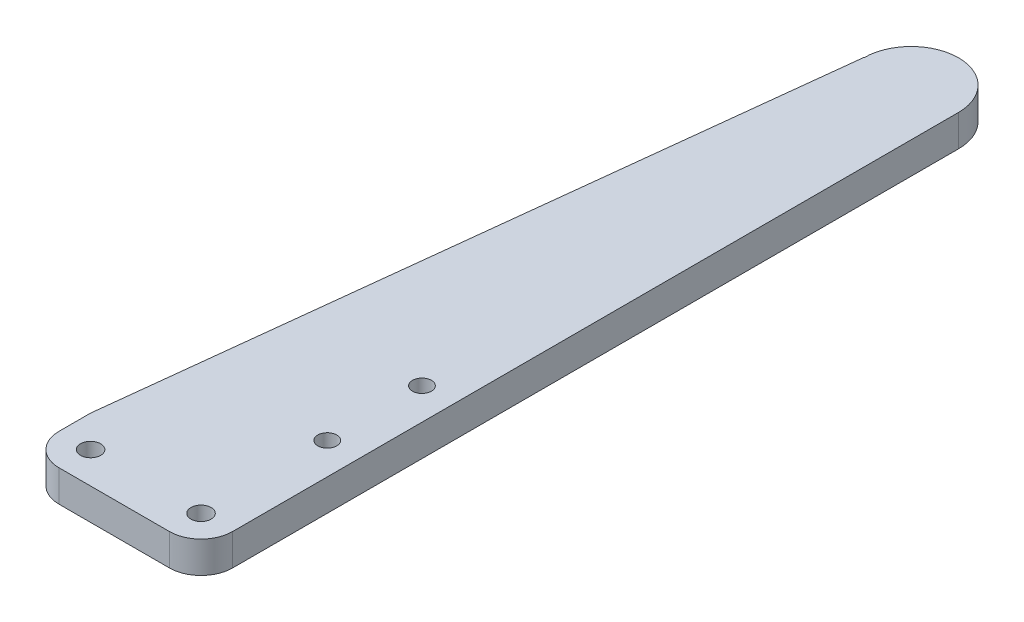
ISO-10303-21;
HEADER;
FILE_DESCRIPTION(('STEP AP214'),'2;1');
FILE_NAME('part.step','',(''),(''),'','','');
FILE_SCHEMA(('AUTOMOTIVE_DESIGN { 1 0 10303 214 1 1 1 1 }'));
ENDSEC;
DATA;
#1=APPLICATION_CONTEXT('core data for automotive mechanical design processes');
#2=APPLICATION_PROTOCOL_DEFINITION('international standard','automotive_design',2000,#1);
#3=PRODUCT_CONTEXT('',#1,'mechanical');
#4=PRODUCT('Part','Part','',(#3));
#5=PRODUCT_RELATED_PRODUCT_CATEGORY('part','',(#4));
#6=PRODUCT_DEFINITION_FORMATION('','',#4);
#7=PRODUCT_DEFINITION_CONTEXT('part definition',#1,'design');
#8=PRODUCT_DEFINITION('design','',#6,#7);
#9=PRODUCT_DEFINITION_SHAPE('','',#8);
#10=(LENGTH_UNIT() NAMED_UNIT(*) SI_UNIT(.MILLI.,.METRE.));
#11=(NAMED_UNIT(*) PLANE_ANGLE_UNIT() SI_UNIT($,.RADIAN.));
#12=(NAMED_UNIT(*) SI_UNIT($,.STERADIAN.) SOLID_ANGLE_UNIT());
#13=UNCERTAINTY_MEASURE_WITH_UNIT(LENGTH_MEASURE(1.E-05),#10,'distance_accuracy_value','');
#14=(GEOMETRIC_REPRESENTATION_CONTEXT(3) GLOBAL_UNCERTAINTY_ASSIGNED_CONTEXT((#13)) GLOBAL_UNIT_ASSIGNED_CONTEXT((#10,
#11,#12)) REPRESENTATION_CONTEXT('',''));
#15=CARTESIAN_POINT('',(0.,0.,0.));
#16=DIRECTION('',(0.,0.,1.));
#17=DIRECTION('',(1.,0.,0.));
#18=AXIS2_PLACEMENT_3D('',#15,#16,#17);
#19=CARTESIAN_POINT('',(6.25000000000002,5.,-60.));
#20=DIRECTION('',(0.,-1.,0.));
#21=DIRECTION('',(0.,0.,-1.));
#22=AXIS2_PLACEMENT_3D('',#19,#20,#21);
#23=CYLINDRICAL_SURFACE('',#22,7.49999999999999);
#24=CARTESIAN_POINT('',(6.25000000000002,0.,-60.));
#25=DIRECTION('',(0.,1.,0.));
#26=DIRECTION('',(0.,0.,1.));
#27=AXIS2_PLACEMENT_3D('',#24,#25,#26);
#28=CIRCLE('',#27,7.49999999999999);
#29=CARTESIAN_POINT('',(13.75,0.,-60.));
#30=VERTEX_POINT('',#29);
#31=CARTESIAN_POINT('',(-1.24999999999996,0.,-60.));
#32=VERTEX_POINT('',#31);
#33=EDGE_CURVE('E125',#30,#32,#28,.T.);
#34=ORIENTED_EDGE('',*,*,#33,.T.);
#35=DIRECTION('',(0.,-1.,0.));
#36=VECTOR('',#35,1.);
#37=CARTESIAN_POINT('',(-1.24999999999996,5.,-60.));
#38=LINE('',#37,#36);
#39=CARTESIAN_POINT('',(-1.24999999999996,5.,-60.));
#40=VERTEX_POINT('',#39);
#41=EDGE_CURVE('E123',#40,#32,#38,.T.);
#42=ORIENTED_EDGE('',*,*,#41,.F.);
#43=CARTESIAN_POINT('',(6.25000000000002,5.,-60.));
#44=DIRECTION('',(0.,1.,0.));
#45=DIRECTION('',(0.,0.,1.));
#46=AXIS2_PLACEMENT_3D('',#43,#44,#45);
#47=CIRCLE('',#46,7.49999999999999);
#48=CARTESIAN_POINT('',(13.75,5.,-60.));
#49=VERTEX_POINT('',#48);
#50=EDGE_CURVE('E108',#49,#40,#47,.T.);
#51=ORIENTED_EDGE('',*,*,#50,.F.);
#52=DIRECTION('',(0.,-1.,0.));
#53=VECTOR('',#52,1.);
#54=CARTESIAN_POINT('',(13.75,5.,-60.));
#55=LINE('',#54,#53);
#56=EDGE_CURVE('E171',#49,#30,#55,.T.);
#57=ORIENTED_EDGE('',*,*,#56,.T.);
#58=EDGE_LOOP('',(#34,#42,#51,#57));
#59=FACE_BOUND('',#58,.T.);
#60=ADVANCED_FACE('F42',(#59),#23,.T.);
#61=CARTESIAN_POINT('',(0.,5.,-60.));
#62=DIRECTION('',(0.,0.,-1.));
#63=DIRECTION('',(-1.,0.,0.));
#64=AXIS2_PLACEMENT_3D('',#61,#62,#63);
#65=PLANE('',#64);
#66=DIRECTION('',(1.,0.,0.));
#67=VECTOR('',#66,1.);
#68=CARTESIAN_POINT('',(0.,0.,-60.));
#69=LINE('',#68,#67);
#70=CARTESIAN_POINT('',(-1.2979011943089,0.,-60.));
#71=VERTEX_POINT('',#70);
#72=EDGE_CURVE('E173',#71,#32,#69,.T.);
#73=ORIENTED_EDGE('',*,*,#72,.F.);
#74=DIRECTION('',(0.,-1.,0.));
#75=VECTOR('',#74,1.);
#76=CARTESIAN_POINT('',(-1.2979011943089,5.,-60.));
#77=LINE('',#76,#75);
#78=CARTESIAN_POINT('',(-1.2979011943089,5.,-60.));
#79=VERTEX_POINT('',#78);
#80=EDGE_CURVE('E130',#79,#71,#77,.T.);
#81=ORIENTED_EDGE('',*,*,#80,.F.);
#82=DIRECTION('',(1.,0.,0.));
#83=VECTOR('',#82,1.);
#84=CARTESIAN_POINT('',(0.,5.,-60.));
#85=LINE('',#84,#83);
#86=EDGE_CURVE('E114',#79,#40,#85,.T.);
#87=ORIENTED_EDGE('',*,*,#86,.T.);
#88=ORIENTED_EDGE('',*,*,#41,.T.);
#89=EDGE_LOOP('',(#73,#81,#87,#88));
#90=FACE_BOUND('',#89,.T.);
#91=ADVANCED_FACE('F132',(#90),#65,.T.);
#92=CARTESIAN_POINT('',(-7.98759846026369,5.,-0.904203320430814));
#93=DIRECTION('',(0.993653706762217,0.,0.112482492138585));
#94=DIRECTION('',(0.112482492138585,0.,-0.993653706762217));
#95=AXIS2_PLACEMENT_3D('',#92,#93,#94);
#96=PLANE('',#95);
#97=DIRECTION('',(-0.112482492138585,0.,0.993653706762217));
#98=VECTOR('',#97,1.);
#99=CARTESIAN_POINT('',(-7.98759846026369,0.,-0.904203320430814));
#100=LINE('',#99,#98);
#101=CARTESIAN_POINT('',(-13.75,0.,50.));
#102=VERTEX_POINT('',#101);
#103=EDGE_CURVE('E175',#71,#102,#100,.T.);
#104=ORIENTED_EDGE('',*,*,#103,.T.);
#105=DIRECTION('',(0.,-1.,0.));
#106=VECTOR('',#105,1.);
#107=CARTESIAN_POINT('',(-13.75,5.,50.));
#108=LINE('',#107,#106);
#109=CARTESIAN_POINT('',(-13.75,5.,50.));
#110=VERTEX_POINT('',#109);
#111=EDGE_CURVE('E197',#110,#102,#108,.T.);
#112=ORIENTED_EDGE('',*,*,#111,.F.);
#113=DIRECTION('',(-0.112482492138585,0.,0.993653706762217));
#114=VECTOR('',#113,1.);
#115=CARTESIAN_POINT('',(-7.98759846026369,5.,-0.904203320430814));
#116=LINE('',#115,#114);
#117=EDGE_CURVE('E135',#79,#110,#116,.T.);
#118=ORIENTED_EDGE('',*,*,#117,.F.);
#119=ORIENTED_EDGE('',*,*,#80,.T.);
#120=EDGE_LOOP('',(#104,#112,#118,#119));
#121=FACE_BOUND('',#120,.T.);
#122=ADVANCED_FACE('F227',(#121),#96,.F.);
#123=CARTESIAN_POINT('',(-13.75,5.,0.));
#124=DIRECTION('',(-1.,0.,0.));
#125=DIRECTION('',(0.,0.,1.));
#126=AXIS2_PLACEMENT_3D('',#123,#124,#125);
#127=PLANE('',#126);
#128=DIRECTION('',(0.,0.,-1.));
#129=VECTOR('',#128,1.);
#130=CARTESIAN_POINT('',(-13.75,0.,0.));
#131=LINE('',#130,#129);
#132=CARTESIAN_POINT('',(-13.75,0.,55.));
#133=VERTEX_POINT('',#132);
#134=EDGE_CURVE('E178',#133,#102,#131,.T.);
#135=ORIENTED_EDGE('',*,*,#134,.F.);
#136=DIRECTION('',(0.,-1.,0.));
#137=VECTOR('',#136,1.);
#138=CARTESIAN_POINT('',(-13.75,5.,55.));
#139=LINE('',#138,#137);
#140=CARTESIAN_POINT('',(-13.75,5.,55.));
#141=VERTEX_POINT('',#140);
#142=EDGE_CURVE('E65',#133,#141,#139,.F.);
#143=ORIENTED_EDGE('',*,*,#142,.T.);
#144=DIRECTION('',(0.,0.,-1.));
#145=VECTOR('',#144,1.);
#146=CARTESIAN_POINT('',(-13.75,5.,0.));
#147=LINE('',#146,#145);
#148=EDGE_CURVE('E138',#141,#110,#147,.T.);
#149=ORIENTED_EDGE('',*,*,#148,.T.);
#150=ORIENTED_EDGE('',*,*,#111,.T.);
#151=EDGE_LOOP('',(#135,#143,#149,#150));
#152=FACE_BOUND('',#151,.T.);
#153=ADVANCED_FACE('F223',(#152),#127,.T.);
#154=CARTESIAN_POINT('',(0.,5.,60.));
#155=DIRECTION('',(0.,0.,-1.));
#156=DIRECTION('',(-1.,0.,0.));
#157=AXIS2_PLACEMENT_3D('',#154,#155,#156);
#158=PLANE('',#157);
#159=DIRECTION('',(1.,0.,0.));
#160=VECTOR('',#159,1.);
#161=CARTESIAN_POINT('',(0.,5.,60.));
#162=LINE('',#161,#160);
#163=CARTESIAN_POINT('',(-8.75,5.,60.));
#164=VERTEX_POINT('',#163);
#165=CARTESIAN_POINT('',(8.75000000000002,5.,60.));
#166=VERTEX_POINT('',#165);
#167=EDGE_CURVE('E217',#164,#166,#162,.T.);
#168=ORIENTED_EDGE('',*,*,#167,.F.);
#169=DIRECTION('',(0.,-1.,0.));
#170=VECTOR('',#169,1.);
#171=CARTESIAN_POINT('',(-8.75,0.,60.));
#172=LINE('',#171,#170);
#173=CARTESIAN_POINT('',(-8.75,0.,60.));
#174=VERTEX_POINT('',#173);
#175=EDGE_CURVE('E202',#164,#174,#172,.T.);
#176=ORIENTED_EDGE('',*,*,#175,.T.);
#177=DIRECTION('',(1.,0.,0.));
#178=VECTOR('',#177,1.);
#179=CARTESIAN_POINT('',(0.,0.,60.));
#180=LINE('',#179,#178);
#181=CARTESIAN_POINT('',(8.75000000000002,0.,60.));
#182=VERTEX_POINT('',#181);
#183=EDGE_CURVE('E180',#174,#182,#180,.T.);
#184=ORIENTED_EDGE('',*,*,#183,.T.);
#185=DIRECTION('',(0.,-1.,0.));
#186=VECTOR('',#185,1.);
#187=CARTESIAN_POINT('',(8.75000000000002,5.,60.));
#188=LINE('',#187,#186);
#189=EDGE_CURVE('E129',#182,#166,#188,.F.);
#190=ORIENTED_EDGE('',*,*,#189,.T.);
#191=EDGE_LOOP('',(#168,#176,#184,#190));
#192=FACE_BOUND('',#191,.T.);
#193=ADVANCED_FACE('F239',(#192),#158,.F.);
#194=CARTESIAN_POINT('',(-8.74999999999999,5.,55.));
#195=DIRECTION('',(0.,-1.,0.));
#196=DIRECTION('',(0.,0.,-1.));
#197=AXIS2_PLACEMENT_3D('',#194,#195,#196);
#198=CYLINDRICAL_SURFACE('',#197,1.6);
#199=CARTESIAN_POINT('',(-8.74999999999999,5.,55.));
#200=DIRECTION('',(0.,1.,0.));
#201=DIRECTION('',(0.,0.,1.));
#202=AXIS2_PLACEMENT_3D('',#199,#200,#201);
#203=CIRCLE('',#202,1.6);
#204=CARTESIAN_POINT('',(-8.74999999999999,5.,56.6));
#205=VERTEX_POINT('',#204);
#206=EDGE_CURVE('E162',#205,#205,#203,.T.);
#207=ORIENTED_EDGE('',*,*,#206,.T.);
#208=EDGE_LOOP('',(#207));
#209=FACE_BOUND('',#208,.T.);
#210=CARTESIAN_POINT('',(-8.74999999999999,0.,55.));
#211=DIRECTION('',(0.,1.,0.));
#212=DIRECTION('',(0.,0.,1.));
#213=AXIS2_PLACEMENT_3D('',#210,#211,#212);
#214=CIRCLE('',#213,1.6);
#215=CARTESIAN_POINT('',(-8.74999999999999,0.,56.6));
#216=VERTEX_POINT('',#215);
#217=EDGE_CURVE('E191',#216,#216,#214,.T.);
#218=ORIENTED_EDGE('',*,*,#217,.F.);
#219=EDGE_LOOP('',(#218));
#220=FACE_BOUND('',#219,.T.);
#221=ADVANCED_FACE('F278',(#209,#220),#198,.F.);
#222=CARTESIAN_POINT('',(8.75000000000002,5.,35.));
#223=DIRECTION('',(0.,-1.,0.));
#224=DIRECTION('',(0.,0.,-1.));
#225=AXIS2_PLACEMENT_3D('',#222,#223,#224);
#226=CYLINDRICAL_SURFACE('',#225,1.5);
#227=CARTESIAN_POINT('',(8.75000000000002,5.,35.));
#228=DIRECTION('',(0.,1.,0.));
#229=DIRECTION('',(0.,0.,1.));
#230=AXIS2_PLACEMENT_3D('',#227,#228,#229);
#231=CIRCLE('',#230,1.5);
#232=CARTESIAN_POINT('',(8.75000000000002,5.,36.5));
#233=VERTEX_POINT('',#232);
#234=EDGE_CURVE('E156',#233,#233,#231,.T.);
#235=ORIENTED_EDGE('',*,*,#234,.T.);
#236=EDGE_LOOP('',(#235));
#237=FACE_BOUND('',#236,.T.);
#238=CARTESIAN_POINT('',(8.75000000000002,0.,35.));
#239=DIRECTION('',(0.,1.,0.));
#240=DIRECTION('',(0.,0.,1.));
#241=AXIS2_PLACEMENT_3D('',#238,#239,#240);
#242=CIRCLE('',#241,1.5);
#243=CARTESIAN_POINT('',(8.75000000000002,0.,36.5));
#244=VERTEX_POINT('',#243);
#245=EDGE_CURVE('E188',#244,#244,#242,.T.);
#246=ORIENTED_EDGE('',*,*,#245,.F.);
#247=EDGE_LOOP('',(#246));
#248=FACE_BOUND('',#247,.T.);
#249=ADVANCED_FACE('F256',(#237,#248),#226,.F.);
#250=CARTESIAN_POINT('',(8.75000000000002,5.,20.));
#251=DIRECTION('',(0.,-1.,0.));
#252=DIRECTION('',(0.,0.,-1.));
#253=AXIS2_PLACEMENT_3D('',#250,#251,#252);
#254=CYLINDRICAL_SURFACE('',#253,1.5);
#255=CARTESIAN_POINT('',(8.75000000000002,5.,20.));
#256=DIRECTION('',(0.,1.,0.));
#257=DIRECTION('',(0.,0.,1.));
#258=AXIS2_PLACEMENT_3D('',#255,#256,#257);
#259=CIRCLE('',#258,1.5);
#260=CARTESIAN_POINT('',(8.75000000000002,5.,21.5));
#261=VERTEX_POINT('',#260);
#262=EDGE_CURVE('E151',#261,#261,#259,.T.);
#263=ORIENTED_EDGE('',*,*,#262,.T.);
#264=EDGE_LOOP('',(#263));
#265=FACE_BOUND('',#264,.T.);
#266=CARTESIAN_POINT('',(8.75000000000002,0.,20.));
#267=DIRECTION('',(0.,1.,0.));
#268=DIRECTION('',(0.,0.,1.));
#269=AXIS2_PLACEMENT_3D('',#266,#267,#268);
#270=CIRCLE('',#269,1.5);
#271=CARTESIAN_POINT('',(8.75000000000002,0.,21.5));
#272=VERTEX_POINT('',#271);
#273=EDGE_CURVE('E185',#272,#272,#270,.T.);
#274=ORIENTED_EDGE('',*,*,#273,.F.);
#275=EDGE_LOOP('',(#274));
#276=FACE_BOUND('',#275,.T.);
#277=ADVANCED_FACE('F248',(#265,#276),#254,.F.);
#278=CARTESIAN_POINT('',(13.75,5.,0.));
#279=DIRECTION('',(-1.,0.,0.));
#280=DIRECTION('',(0.,0.,1.));
#281=AXIS2_PLACEMENT_3D('',#278,#279,#280);
#282=PLANE('',#281);
#283=DIRECTION('',(0.,0.,-1.));
#284=VECTOR('',#283,1.);
#285=CARTESIAN_POINT('',(13.75,5.,0.));
#286=LINE('',#285,#284);
#287=CARTESIAN_POINT('',(13.75,5.,55.));
#288=VERTEX_POINT('',#287);
#289=EDGE_CURVE('E115',#288,#49,#286,.T.);
#290=ORIENTED_EDGE('',*,*,#289,.F.);
#291=DIRECTION('',(0.,-1.,0.));
#292=VECTOR('',#291,1.);
#293=CARTESIAN_POINT('',(13.75,5.,55.));
#294=LINE('',#293,#292);
#295=CARTESIAN_POINT('',(13.75,0.,55.));
#296=VERTEX_POINT('',#295);
#297=EDGE_CURVE('E12',#288,#296,#294,.T.);
#298=ORIENTED_EDGE('',*,*,#297,.T.);
#299=DIRECTION('',(0.,0.,-1.));
#300=VECTOR('',#299,1.);
#301=CARTESIAN_POINT('',(13.75,0.,0.));
#302=LINE('',#301,#300);
#303=EDGE_CURVE('E183',#296,#30,#302,.T.);
#304=ORIENTED_EDGE('',*,*,#303,.T.);
#305=ORIENTED_EDGE('',*,*,#56,.F.);
#306=EDGE_LOOP('',(#290,#298,#304,#305));
#307=FACE_BOUND('',#306,.T.);
#308=ADVANCED_FACE('F245',(#307),#282,.F.);
#309=CARTESIAN_POINT('',(8.75000000000001,5.,55.));
#310=DIRECTION('',(0.,-1.,0.));
#311=DIRECTION('',(0.,0.,-1.));
#312=AXIS2_PLACEMENT_3D('',#309,#310,#311);
#313=CYLINDRICAL_SURFACE('',#312,1.6);
#314=CARTESIAN_POINT('',(8.75000000000001,5.,55.));
#315=DIRECTION('',(0.,1.,0.));
#316=DIRECTION('',(0.,0.,1.));
#317=AXIS2_PLACEMENT_3D('',#314,#315,#316);
#318=CIRCLE('',#317,1.6);
#319=CARTESIAN_POINT('',(8.75000000000001,5.,56.6));
#320=VERTEX_POINT('',#319);
#321=EDGE_CURVE('E167',#320,#320,#318,.F.);
#322=ORIENTED_EDGE('',*,*,#321,.F.);
#323=EDGE_LOOP('',(#322));
#324=FACE_BOUND('',#323,.T.);
#325=CARTESIAN_POINT('',(8.75000000000001,0.,55.));
#326=DIRECTION('',(0.,1.,0.));
#327=DIRECTION('',(0.,0.,1.));
#328=AXIS2_PLACEMENT_3D('',#325,#326,#327);
#329=CIRCLE('',#328,1.6);
#330=CARTESIAN_POINT('',(8.75000000000001,0.,56.6));
#331=VERTEX_POINT('',#330);
#332=EDGE_CURVE('E120',#331,#331,#329,.F.);
#333=ORIENTED_EDGE('',*,*,#332,.T.);
#334=EDGE_LOOP('',(#333));
#335=FACE_BOUND('',#334,.T.);
#336=ADVANCED_FACE('F247',(#324,#335),#313,.F.);
#337=CARTESIAN_POINT('',(0.,5.,0.));
#338=DIRECTION('',(0.,1.,0.));
#339=DIRECTION('',(0.,0.,1.));
#340=AXIS2_PLACEMENT_3D('',#337,#338,#339);
#341=PLANE('',#340);
#342=ORIENTED_EDGE('',*,*,#148,.F.);
#343=CARTESIAN_POINT('',(-8.75,5.,55.));
#344=DIRECTION('',(0.,1.,0.));
#345=DIRECTION('',(0.,0.,1.));
#346=AXIS2_PLACEMENT_3D('',#343,#344,#345);
#347=CIRCLE('',#346,5.);
#348=EDGE_CURVE('E50',#141,#164,#347,.T.);
#349=ORIENTED_EDGE('',*,*,#348,.T.);
#350=ORIENTED_EDGE('',*,*,#167,.T.);
#351=CARTESIAN_POINT('',(8.75000000000002,5.,55.));
#352=DIRECTION('',(0.,1.,0.));
#353=DIRECTION('',(0.,0.,1.));
#354=AXIS2_PLACEMENT_3D('',#351,#352,#353);
#355=CIRCLE('',#354,5.);
#356=EDGE_CURVE('E57',#166,#288,#355,.T.);
#357=ORIENTED_EDGE('',*,*,#356,.T.);
#358=ORIENTED_EDGE('',*,*,#289,.T.);
#359=ORIENTED_EDGE('',*,*,#50,.T.);
#360=ORIENTED_EDGE('',*,*,#86,.F.);
#361=ORIENTED_EDGE('',*,*,#117,.T.);
#362=EDGE_LOOP('',(#342,#349,#350,#357,#358,#359,#360,#361));
#363=FACE_BOUND('',#362,.T.);
#364=ORIENTED_EDGE('',*,*,#262,.F.);
#365=EDGE_LOOP('',(#364));
#366=FACE_BOUND('',#365,.T.);
#367=ORIENTED_EDGE('',*,*,#234,.F.);
#368=EDGE_LOOP('',(#367));
#369=FACE_BOUND('',#368,.T.);
#370=ORIENTED_EDGE('',*,*,#206,.F.);
#371=EDGE_LOOP('',(#370));
#372=FACE_BOUND('',#371,.T.);
#373=ORIENTED_EDGE('',*,*,#321,.T.);
#374=EDGE_LOOP('',(#373));
#375=FACE_BOUND('',#374,.T.);
#376=ADVANCED_FACE('F110',(#363,#366,#369,#372,#375),#341,.T.);
#377=CARTESIAN_POINT('',(0.,0.,0.));
#378=DIRECTION('',(0.,1.,0.));
#379=DIRECTION('',(0.,0.,1.));
#380=AXIS2_PLACEMENT_3D('',#377,#378,#379);
#381=PLANE('',#380);
#382=ORIENTED_EDGE('',*,*,#183,.F.);
#383=CARTESIAN_POINT('',(-8.75,0.,55.));
#384=DIRECTION('',(0.,1.,0.));
#385=DIRECTION('',(0.,0.,1.));
#386=AXIS2_PLACEMENT_3D('',#383,#384,#385);
#387=CIRCLE('',#386,5.);
#388=EDGE_CURVE('E207',#174,#133,#387,.F.);
#389=ORIENTED_EDGE('',*,*,#388,.T.);
#390=ORIENTED_EDGE('',*,*,#134,.T.);
#391=ORIENTED_EDGE('',*,*,#103,.F.);
#392=ORIENTED_EDGE('',*,*,#72,.T.);
#393=ORIENTED_EDGE('',*,*,#33,.F.);
#394=ORIENTED_EDGE('',*,*,#303,.F.);
#395=CARTESIAN_POINT('',(8.75000000000002,0.,55.));
#396=DIRECTION('',(0.,1.,0.));
#397=DIRECTION('',(0.,0.,1.));
#398=AXIS2_PLACEMENT_3D('',#395,#396,#397);
#399=CIRCLE('',#398,5.);
#400=EDGE_CURVE('E205',#296,#182,#399,.F.);
#401=ORIENTED_EDGE('',*,*,#400,.T.);
#402=EDGE_LOOP('',(#382,#389,#390,#391,#392,#393,#394,#401));
#403=FACE_BOUND('',#402,.T.);
#404=ORIENTED_EDGE('',*,*,#273,.T.);
#405=EDGE_LOOP('',(#404));
#406=FACE_BOUND('',#405,.T.);
#407=ORIENTED_EDGE('',*,*,#245,.T.);
#408=EDGE_LOOP('',(#407));
#409=FACE_BOUND('',#408,.T.);
#410=ORIENTED_EDGE('',*,*,#217,.T.);
#411=EDGE_LOOP('',(#410));
#412=FACE_BOUND('',#411,.T.);
#413=ORIENTED_EDGE('',*,*,#332,.F.);
#414=EDGE_LOOP('',(#413));
#415=FACE_BOUND('',#414,.T.);
#416=ADVANCED_FACE('F231',(#403,#406,#409,#412,#415),#381,.F.);
#417=CARTESIAN_POINT('',(-8.75,5.,55.));
#418=DIRECTION('',(0.,1.,0.));
#419=DIRECTION('',(0.,0.,1.));
#420=AXIS2_PLACEMENT_3D('',#417,#418,#419);
#421=CYLINDRICAL_SURFACE('',#420,5.);
#422=ORIENTED_EDGE('',*,*,#348,.F.);
#423=ORIENTED_EDGE('',*,*,#142,.F.);
#424=ORIENTED_EDGE('',*,*,#388,.F.);
#425=ORIENTED_EDGE('',*,*,#175,.F.);
#426=EDGE_LOOP('',(#422,#423,#424,#425));
#427=FACE_BOUND('',#426,.T.);
#428=ADVANCED_FACE('F234',(#427),#421,.T.);
#429=CARTESIAN_POINT('',(8.75000000000002,5.,55.));
#430=DIRECTION('',(0.,-1.,0.));
#431=DIRECTION('',(0.,0.,-1.));
#432=AXIS2_PLACEMENT_3D('',#429,#430,#431);
#433=CYLINDRICAL_SURFACE('',#432,5.);
#434=ORIENTED_EDGE('',*,*,#356,.F.);
#435=ORIENTED_EDGE('',*,*,#189,.F.);
#436=ORIENTED_EDGE('',*,*,#400,.F.);
#437=ORIENTED_EDGE('',*,*,#297,.F.);
#438=EDGE_LOOP('',(#434,#435,#436,#437));
#439=FACE_BOUND('',#438,.T.);
#440=ADVANCED_FACE('F44',(#439),#433,.T.);
#441=CLOSED_SHELL('',(#60,#91,#122,#153,#193,#221,#249,#277,#308,#336,#376,#416,#428,#440));
#442=MANIFOLD_SOLID_BREP('B2',#441);
#443=ADVANCED_BREP_SHAPE_REPRESENTATION('',(#18,#442),#14);
#444=SHAPE_DEFINITION_REPRESENTATION(#9,#443);
ENDSEC;
END-ISO-10303-21;
